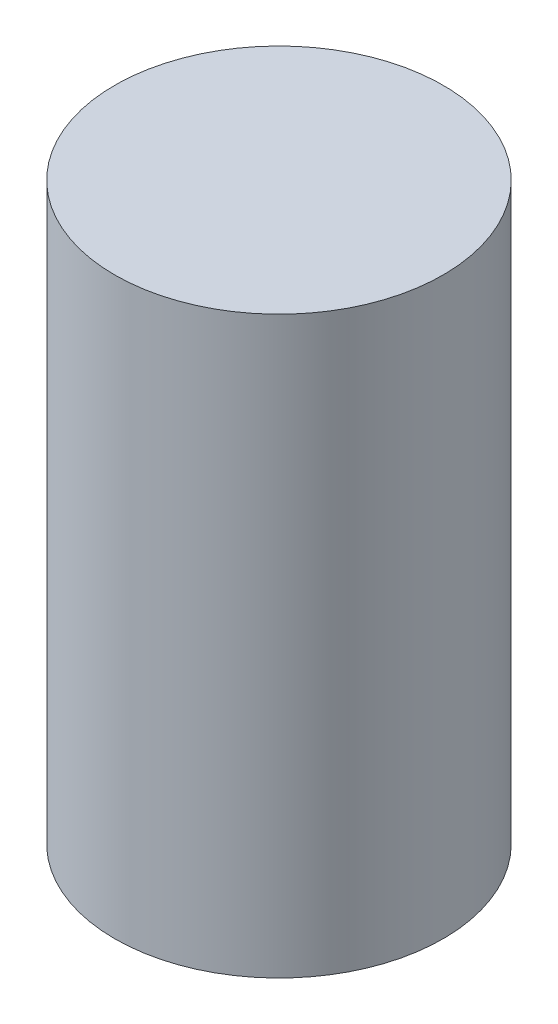
ISO-10303-21;
HEADER;
FILE_DESCRIPTION(('STEP AP214'),'2;1');
FILE_NAME('part.step','',(''),(''),'','','');
FILE_SCHEMA(('AUTOMOTIVE_DESIGN { 1 0 10303 214 1 1 1 1 }'));
ENDSEC;
DATA;
#1=APPLICATION_CONTEXT('core data for automotive mechanical design processes');
#2=APPLICATION_PROTOCOL_DEFINITION('international standard','automotive_design',2000,#1);
#3=PRODUCT_CONTEXT('',#1,'mechanical');
#4=PRODUCT('Part','Part','',(#3));
#5=PRODUCT_RELATED_PRODUCT_CATEGORY('part','',(#4));
#6=PRODUCT_DEFINITION_FORMATION('','',#4);
#7=PRODUCT_DEFINITION_CONTEXT('part definition',#1,'design');
#8=PRODUCT_DEFINITION('design','',#6,#7);
#9=PRODUCT_DEFINITION_SHAPE('','',#8);
#10=(LENGTH_UNIT() NAMED_UNIT(*) SI_UNIT(.MILLI.,.METRE.));
#11=(NAMED_UNIT(*) PLANE_ANGLE_UNIT() SI_UNIT($,.RADIAN.));
#12=(NAMED_UNIT(*) SI_UNIT($,.STERADIAN.) SOLID_ANGLE_UNIT());
#13=UNCERTAINTY_MEASURE_WITH_UNIT(LENGTH_MEASURE(1.E-05),#10,'distance_accuracy_value','');
#14=(GEOMETRIC_REPRESENTATION_CONTEXT(3) GLOBAL_UNCERTAINTY_ASSIGNED_CONTEXT((#13)) GLOBAL_UNIT_ASSIGNED_CONTEXT((#10,
#11,#12)) REPRESENTATION_CONTEXT('',''));
#15=CARTESIAN_POINT('',(0.,0.,0.));
#16=DIRECTION('',(0.,0.,1.));
#17=DIRECTION('',(1.,0.,0.));
#18=AXIS2_PLACEMENT_3D('',#15,#16,#17);
#19=CARTESIAN_POINT('',(0.,35.,0.));
#20=DIRECTION('',(0.,-1.,0.));
#21=DIRECTION('',(0.,0.,-1.));
#22=AXIS2_PLACEMENT_3D('',#19,#20,#21);
#23=CYLINDRICAL_SURFACE('',#22,10.);
#24=CARTESIAN_POINT('',(0.,35.,0.));
#25=DIRECTION('',(0.,1.,0.));
#26=DIRECTION('',(0.,0.,1.));
#27=AXIS2_PLACEMENT_3D('',#24,#25,#26);
#28=CIRCLE('',#27,10.);
#29=CARTESIAN_POINT('',(0.,35.,10.));
#30=VERTEX_POINT('',#29);
#31=EDGE_CURVE('E10',#30,#30,#28,.T.);
#32=ORIENTED_EDGE('',*,*,#31,.F.);
#33=EDGE_LOOP('',(#32));
#34=FACE_BOUND('',#33,.T.);
#35=CARTESIAN_POINT('',(0.,0.,0.));
#36=DIRECTION('',(0.,1.,0.));
#37=DIRECTION('',(0.,0.,1.));
#38=AXIS2_PLACEMENT_3D('',#35,#36,#37);
#39=CIRCLE('',#38,10.);
#40=CARTESIAN_POINT('',(0.,0.,10.));
#41=VERTEX_POINT('',#40);
#42=EDGE_CURVE('E34',#41,#41,#39,.T.);
#43=ORIENTED_EDGE('',*,*,#42,.T.);
#44=EDGE_LOOP('',(#43));
#45=FACE_BOUND('',#44,.T.);
#46=ADVANCED_FACE('F31',(#34,#45),#23,.T.);
#47=CARTESIAN_POINT('',(0.,35.,0.));
#48=DIRECTION('',(0.,1.,0.));
#49=DIRECTION('',(0.,0.,1.));
#50=AXIS2_PLACEMENT_3D('',#47,#48,#49);
#51=PLANE('',#50);
#52=ORIENTED_EDGE('',*,*,#31,.T.);
#53=EDGE_LOOP('',(#52));
#54=FACE_BOUND('',#53,.T.);
#55=ADVANCED_FACE('F46',(#54),#51,.T.);
#56=CARTESIAN_POINT('',(0.,0.,0.));
#57=DIRECTION('',(0.,1.,0.));
#58=DIRECTION('',(0.,0.,1.));
#59=AXIS2_PLACEMENT_3D('',#56,#57,#58);
#60=PLANE('',#59);
#61=ORIENTED_EDGE('',*,*,#42,.F.);
#62=EDGE_LOOP('',(#61));
#63=FACE_BOUND('',#62,.T.);
#64=ADVANCED_FACE('F44',(#63),#60,.F.);
#65=CLOSED_SHELL('',(#46,#55,#64));
#66=MANIFOLD_SOLID_BREP('B2',#65);
#67=ADVANCED_BREP_SHAPE_REPRESENTATION('',(#18,#66),#14);
#68=SHAPE_DEFINITION_REPRESENTATION(#9,#67);
ENDSEC;
END-ISO-10303-21;
